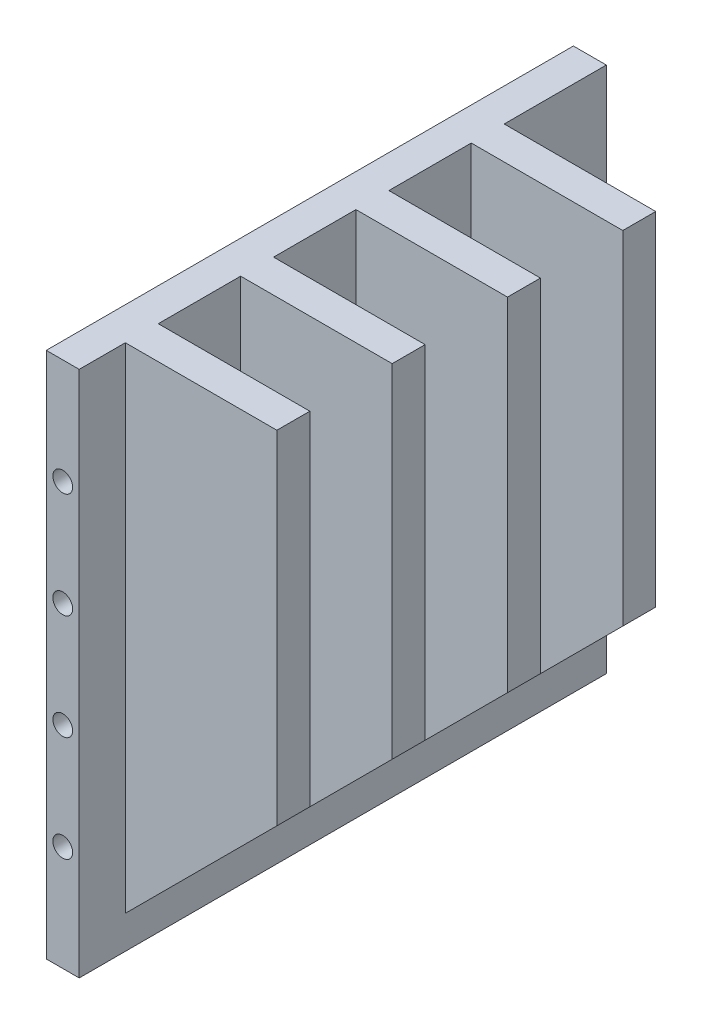
ISO-10303-21;
HEADER;
FILE_DESCRIPTION(('STEP AP214'),'2;1');
FILE_NAME('part.step','',(''),(''),'','','');
FILE_SCHEMA(('AUTOMOTIVE_DESIGN { 1 0 10303 214 1 1 1 1 }'));
ENDSEC;
DATA;
#1=APPLICATION_CONTEXT('core data for automotive mechanical design processes');
#2=APPLICATION_PROTOCOL_DEFINITION('international standard','automotive_design',2000,#1);
#3=PRODUCT_CONTEXT('',#1,'mechanical');
#4=PRODUCT('Part','Part','',(#3));
#5=PRODUCT_RELATED_PRODUCT_CATEGORY('part','',(#4));
#6=PRODUCT_DEFINITION_FORMATION('','',#4);
#7=PRODUCT_DEFINITION_CONTEXT('part definition',#1,'design');
#8=PRODUCT_DEFINITION('design','',#6,#7);
#9=PRODUCT_DEFINITION_SHAPE('','',#8);
#10=(LENGTH_UNIT() NAMED_UNIT(*) SI_UNIT(.MILLI.,.METRE.));
#11=(NAMED_UNIT(*) PLANE_ANGLE_UNIT() SI_UNIT($,.RADIAN.));
#12=(NAMED_UNIT(*) SI_UNIT($,.STERADIAN.) SOLID_ANGLE_UNIT());
#13=UNCERTAINTY_MEASURE_WITH_UNIT(LENGTH_MEASURE(1.E-05),#10,'distance_accuracy_value','');
#14=(GEOMETRIC_REPRESENTATION_CONTEXT(3) GLOBAL_UNCERTAINTY_ASSIGNED_CONTEXT((#13)) GLOBAL_UNIT_ASSIGNED_CONTEXT((#10,
#11,#12)) REPRESENTATION_CONTEXT('',''));
#15=CARTESIAN_POINT('',(0.,0.,0.));
#16=DIRECTION('',(0.,0.,1.));
#17=DIRECTION('',(1.,0.,0.));
#18=AXIS2_PLACEMENT_3D('',#15,#16,#17);
#19=CARTESIAN_POINT('',(6.34999999999999,101.6,-52.07));
#20=DIRECTION('',(-1.,0.,0.));
#21=DIRECTION('',(0.,0.,1.));
#22=AXIS2_PLACEMENT_3D('',#19,#20,#21);
#23=PLANE('',#22);
#24=DIRECTION('',(0.,0.,1.));
#25=VECTOR('',#24,1.);
#26=CARTESIAN_POINT('',(6.35,6.34999999999933,-26.035));
#27=LINE('',#26,#25);
#28=CARTESIAN_POINT('',(6.34999999999999,6.34999999999933,-32.385));
#29=VERTEX_POINT('',#28);
#30=CARTESIAN_POINT('',(6.35,6.34999999999933,-26.035));
#31=VERTEX_POINT('',#30);
#32=EDGE_CURVE('E509',#29,#31,#27,.T.);
#33=ORIENTED_EDGE('',*,*,#32,.T.);
#34=DIRECTION('',(0.,1.,0.));
#35=VECTOR('',#34,1.);
#36=CARTESIAN_POINT('',(6.34999999999999,44.45,-26.035));
#37=LINE('',#36,#35);
#38=CARTESIAN_POINT('',(6.35000000000003,101.6,-26.035));
#39=VERTEX_POINT('',#38);
#40=EDGE_CURVE('E289',#31,#39,#37,.T.);
#41=ORIENTED_EDGE('',*,*,#40,.T.);
#42=DIRECTION('',(0.,0.,-1.));
#43=VECTOR('',#42,1.);
#44=CARTESIAN_POINT('',(6.35000000000001,101.6,19.05));
#45=LINE('',#44,#43);
#46=CARTESIAN_POINT('',(6.35000000000002,101.6,-10.16));
#47=VERTEX_POINT('',#46);
#48=EDGE_CURVE('E228',#47,#39,#45,.T.);
#49=ORIENTED_EDGE('',*,*,#48,.F.);
#50=DIRECTION('',(0.,1.,0.));
#51=VECTOR('',#50,1.);
#52=CARTESIAN_POINT('',(6.34999999999999,44.45,-10.16));
#53=LINE('',#52,#51);
#54=CARTESIAN_POINT('',(6.34999999999999,6.34999999999933,-10.16));
#55=VERTEX_POINT('',#54);
#56=EDGE_CURVE('E312',#55,#47,#53,.T.);
#57=ORIENTED_EDGE('',*,*,#56,.F.);
#58=DIRECTION('',(0.,0.,1.));
#59=VECTOR('',#58,1.);
#60=CARTESIAN_POINT('',(6.35000000000001,6.34999999999933,-3.81000000000001));
#61=LINE('',#60,#59);
#62=CARTESIAN_POINT('',(6.35000000000001,6.34999999999933,-3.81000000000001));
#63=VERTEX_POINT('',#62);
#64=EDGE_CURVE('E539',#55,#63,#61,.T.);
#65=ORIENTED_EDGE('',*,*,#64,.T.);
#66=DIRECTION('',(0.,1.,0.));
#67=VECTOR('',#66,1.);
#68=CARTESIAN_POINT('',(6.34999999999999,44.45,-3.81000000000001));
#69=LINE('',#68,#67);
#70=CARTESIAN_POINT('',(6.34999999999999,101.6,-3.81000000000001));
#71=VERTEX_POINT('',#70);
#72=EDGE_CURVE('E313',#63,#71,#69,.T.);
#73=ORIENTED_EDGE('',*,*,#72,.T.);
#74=CARTESIAN_POINT('',(6.35000000000001,101.6,12.065));
#75=VERTEX_POINT('',#74);
#76=EDGE_CURVE('E225',#75,#71,#45,.T.);
#77=ORIENTED_EDGE('',*,*,#76,.F.);
#78=DIRECTION('',(0.,1.,0.));
#79=VECTOR('',#78,1.);
#80=CARTESIAN_POINT('',(6.34999999999999,44.45,12.065));
#81=LINE('',#80,#79);
#82=CARTESIAN_POINT('',(6.34999999999999,6.34999999999933,12.065));
#83=VERTEX_POINT('',#82);
#84=EDGE_CURVE('E336',#83,#75,#81,.T.);
#85=ORIENTED_EDGE('',*,*,#84,.F.);
#86=DIRECTION('',(0.,0.,1.));
#87=VECTOR('',#86,1.);
#88=CARTESIAN_POINT('',(6.35000000000002,6.34999999999933,18.415));
#89=LINE('',#88,#87);
#90=CARTESIAN_POINT('',(6.35000000000002,6.34999999999933,18.415));
#91=VERTEX_POINT('',#90);
#92=EDGE_CURVE('E449',#83,#91,#89,.T.);
#93=ORIENTED_EDGE('',*,*,#92,.T.);
#94=DIRECTION('',(0.,1.,0.));
#95=VECTOR('',#94,1.);
#96=CARTESIAN_POINT('',(6.34999999999999,44.45,18.415));
#97=LINE('',#96,#95);
#98=CARTESIAN_POINT('',(6.34999999999999,101.6,18.415));
#99=VERTEX_POINT('',#98);
#100=EDGE_CURVE('E337',#91,#99,#97,.T.);
#101=ORIENTED_EDGE('',*,*,#100,.T.);
#102=CARTESIAN_POINT('',(6.35,101.6,34.29));
#103=VERTEX_POINT('',#102);
#104=EDGE_CURVE('E217',#103,#99,#45,.T.);
#105=ORIENTED_EDGE('',*,*,#104,.F.);
#106=DIRECTION('',(0.,1.,0.));
#107=VECTOR('',#106,1.);
#108=CARTESIAN_POINT('',(6.35,44.45,34.29));
#109=LINE('',#108,#107);
#110=CARTESIAN_POINT('',(6.35,6.34999999999933,34.29));
#111=VERTEX_POINT('',#110);
#112=EDGE_CURVE('E359',#111,#103,#109,.T.);
#113=ORIENTED_EDGE('',*,*,#112,.F.);
#114=DIRECTION('',(0.,0.,1.));
#115=VECTOR('',#114,1.);
#116=CARTESIAN_POINT('',(6.35000000000004,6.34999999999933,40.64));
#117=LINE('',#116,#115);
#118=CARTESIAN_POINT('',(6.35000000000004,6.34999999999933,40.64));
#119=VERTEX_POINT('',#118);
#120=EDGE_CURVE('E207',#111,#119,#117,.T.);
#121=ORIENTED_EDGE('',*,*,#120,.T.);
#122=DIRECTION('',(0.,1.,0.));
#123=VECTOR('',#122,1.);
#124=CARTESIAN_POINT('',(6.35,44.45,40.64));
#125=LINE('',#124,#123);
#126=CARTESIAN_POINT('',(6.35,101.6,40.64));
#127=VERTEX_POINT('',#126);
#128=EDGE_CURVE('E189',#119,#127,#125,.T.);
#129=ORIENTED_EDGE('',*,*,#128,.T.);
#130=CARTESIAN_POINT('',(6.34999999999999,101.6,49.53));
#131=VERTEX_POINT('',#130);
#132=EDGE_CURVE('E205',#131,#127,#45,.T.);
#133=ORIENTED_EDGE('',*,*,#132,.F.);
#134=DIRECTION('',(0.,-1.,0.));
#135=VECTOR('',#134,1.);
#136=CARTESIAN_POINT('',(6.34999999999999,101.6,49.53));
#137=LINE('',#136,#135);
#138=CARTESIAN_POINT('',(6.34999999999999,0.,49.53));
#139=VERTEX_POINT('',#138);
#140=EDGE_CURVE('E518',#131,#139,#137,.T.);
#141=ORIENTED_EDGE('',*,*,#140,.T.);
#142=DIRECTION('',(0.,0.,-1.));
#143=VECTOR('',#142,1.);
#144=CARTESIAN_POINT('',(6.34999999999999,0.,-52.07));
#145=LINE('',#144,#143);
#146=CARTESIAN_POINT('',(6.34999999999999,0.,-52.07));
#147=VERTEX_POINT('',#146);
#148=EDGE_CURVE('E513',#139,#147,#145,.T.);
#149=ORIENTED_EDGE('',*,*,#148,.T.);
#150=DIRECTION('',(0.,-1.,0.));
#151=VECTOR('',#150,1.);
#152=CARTESIAN_POINT('',(6.34999999999999,101.6,-52.07));
#153=LINE('',#152,#151);
#154=CARTESIAN_POINT('',(6.34999999999999,101.6,-52.07));
#155=VERTEX_POINT('',#154);
#156=EDGE_CURVE('E511',#155,#147,#153,.T.);
#157=ORIENTED_EDGE('',*,*,#156,.F.);
#158=CARTESIAN_POINT('',(6.34999999999999,101.6,-32.385));
#159=VERTEX_POINT('',#158);
#160=EDGE_CURVE('E219',#159,#155,#45,.T.);
#161=ORIENTED_EDGE('',*,*,#160,.F.);
#162=DIRECTION('',(0.,1.,0.));
#163=VECTOR('',#162,1.);
#164=CARTESIAN_POINT('',(6.34999999999999,44.45,-32.385));
#165=LINE('',#164,#163);
#166=EDGE_CURVE('E285',#29,#159,#165,.T.);
#167=ORIENTED_EDGE('',*,*,#166,.F.);
#168=EDGE_LOOP('',(#33,#41,#49,#57,#65,#73,#77,#85,#93,#101,#105,#113,#121,#129,#133,#141,#149,
#157,#161,#167));
#169=FACE_BOUND('',#168,.T.);
#170=ADVANCED_FACE('F41',(#169),#23,.F.);
#171=CARTESIAN_POINT('',(6.34999999999999,101.6,49.53));
#172=DIRECTION('',(0.,0.,-1.));
#173=DIRECTION('',(-1.,0.,0.));
#174=AXIS2_PLACEMENT_3D('',#171,#172,#173);
#175=PLANE('',#174);
#176=CARTESIAN_POINT('',(3.175,81.28,49.53));
#177=DIRECTION('',(0.,0.,1.));
#178=DIRECTION('',(1.,0.,0.));
#179=AXIS2_PLACEMENT_3D('',#176,#177,#178);
#180=CIRCLE('',#179,1.90500000000002);
#181=CARTESIAN_POINT('',(5.08000000000001,81.28,49.53));
#182=VERTEX_POINT('',#181);
#183=EDGE_CURVE('E256',#182,#182,#180,.T.);
#184=ORIENTED_EDGE('',*,*,#183,.F.);
#185=EDGE_LOOP('',(#184));
#186=FACE_BOUND('',#185,.T.);
#187=CARTESIAN_POINT('',(3.175,40.64,49.53));
#188=DIRECTION('',(0.,0.,1.));
#189=DIRECTION('',(1.,0.,0.));
#190=AXIS2_PLACEMENT_3D('',#187,#188,#189);
#191=CIRCLE('',#190,1.905);
#192=CARTESIAN_POINT('',(5.08,40.64,49.53));
#193=VERTEX_POINT('',#192);
#194=EDGE_CURVE('E257',#193,#193,#191,.T.);
#195=ORIENTED_EDGE('',*,*,#194,.F.);
#196=EDGE_LOOP('',(#195));
#197=FACE_BOUND('',#196,.T.);
#198=CARTESIAN_POINT('',(3.17499999999999,20.32,49.53));
#199=DIRECTION('',(0.,0.,1.));
#200=DIRECTION('',(1.,0.,0.));
#201=AXIS2_PLACEMENT_3D('',#198,#199,#200);
#202=CIRCLE('',#201,1.905);
#203=CARTESIAN_POINT('',(5.07999999999999,20.32,49.53));
#204=VERTEX_POINT('',#203);
#205=EDGE_CURVE('E239',#204,#204,#202,.T.);
#206=ORIENTED_EDGE('',*,*,#205,.F.);
#207=EDGE_LOOP('',(#206));
#208=FACE_BOUND('',#207,.T.);
#209=CARTESIAN_POINT('',(3.175,60.96,49.53));
#210=DIRECTION('',(0.,0.,1.));
#211=DIRECTION('',(1.,0.,0.));
#212=AXIS2_PLACEMENT_3D('',#209,#210,#211);
#213=CIRCLE('',#212,1.905);
#214=CARTESIAN_POINT('',(5.08,60.96,49.53));
#215=VERTEX_POINT('',#214);
#216=EDGE_CURVE('E248',#215,#215,#213,.T.);
#217=ORIENTED_EDGE('',*,*,#216,.F.);
#218=EDGE_LOOP('',(#217));
#219=FACE_BOUND('',#218,.T.);
#220=DIRECTION('',(1.,0.,0.));
#221=VECTOR('',#220,1.);
#222=CARTESIAN_POINT('',(6.34999999999999,0.,49.53));
#223=LINE('',#222,#221);
#224=CARTESIAN_POINT('',(0.,0.,49.53));
#225=VERTEX_POINT('',#224);
#226=EDGE_CURVE('E272',#225,#139,#223,.T.);
#227=ORIENTED_EDGE('',*,*,#226,.T.);
#228=ORIENTED_EDGE('',*,*,#140,.F.);
#229=DIRECTION('',(1.,0.,0.));
#230=VECTOR('',#229,1.);
#231=CARTESIAN_POINT('',(6.34999999999999,101.6,49.53));
#232=LINE('',#231,#230);
#233=CARTESIAN_POINT('',(0.,101.6,49.53));
#234=VERTEX_POINT('',#233);
#235=EDGE_CURVE('E213',#234,#131,#232,.T.);
#236=ORIENTED_EDGE('',*,*,#235,.F.);
#237=DIRECTION('',(0.,-1.,0.));
#238=VECTOR('',#237,1.);
#239=CARTESIAN_POINT('',(0.,101.6,49.53));
#240=LINE('',#239,#238);
#241=EDGE_CURVE('E525',#234,#225,#240,.T.);
#242=ORIENTED_EDGE('',*,*,#241,.T.);
#243=EDGE_LOOP('',(#227,#228,#236,#242));
#244=FACE_BOUND('',#243,.T.);
#245=ADVANCED_FACE('F407',(#186,#197,#208,#219,#244),#175,.F.);
#246=CARTESIAN_POINT('',(0.,101.6,-52.07));
#247=DIRECTION('',(0.,0.,1.));
#248=DIRECTION('',(1.,0.,0.));
#249=AXIS2_PLACEMENT_3D('',#246,#247,#248);
#250=PLANE('',#249);
#251=CARTESIAN_POINT('',(3.175,81.28,-52.07));
#252=DIRECTION('',(0.,0.,1.));
#253=DIRECTION('',(1.,0.,0.));
#254=AXIS2_PLACEMENT_3D('',#251,#252,#253);
#255=CIRCLE('',#254,1.90500000000002);
#256=CARTESIAN_POINT('',(5.08000000000001,81.28,-52.07));
#257=VERTEX_POINT('',#256);
#258=EDGE_CURVE('E198',#257,#257,#255,.T.);
#259=ORIENTED_EDGE('',*,*,#258,.T.);
#260=EDGE_LOOP('',(#259));
#261=FACE_BOUND('',#260,.T.);
#262=CARTESIAN_POINT('',(3.175,40.64,-52.07));
#263=DIRECTION('',(0.,0.,1.));
#264=DIRECTION('',(1.,0.,0.));
#265=AXIS2_PLACEMENT_3D('',#262,#263,#264);
#266=CIRCLE('',#265,1.905);
#267=CARTESIAN_POINT('',(5.08,40.64,-52.07));
#268=VERTEX_POINT('',#267);
#269=EDGE_CURVE('E377',#268,#268,#266,.T.);
#270=ORIENTED_EDGE('',*,*,#269,.T.);
#271=EDGE_LOOP('',(#270));
#272=FACE_BOUND('',#271,.T.);
#273=CARTESIAN_POINT('',(3.17499999999999,20.32,-52.07));
#274=DIRECTION('',(0.,0.,1.));
#275=DIRECTION('',(1.,0.,0.));
#276=AXIS2_PLACEMENT_3D('',#273,#274,#275);
#277=CIRCLE('',#276,1.905);
#278=CARTESIAN_POINT('',(5.07999999999999,20.32,-52.07));
#279=VERTEX_POINT('',#278);
#280=EDGE_CURVE('E372',#279,#279,#277,.T.);
#281=ORIENTED_EDGE('',*,*,#280,.T.);
#282=EDGE_LOOP('',(#281));
#283=FACE_BOUND('',#282,.T.);
#284=CARTESIAN_POINT('',(3.175,60.96,-52.07));
#285=DIRECTION('',(0.,0.,1.));
#286=DIRECTION('',(1.,0.,0.));
#287=AXIS2_PLACEMENT_3D('',#284,#285,#286);
#288=CIRCLE('',#287,1.905);
#289=CARTESIAN_POINT('',(5.08,60.96,-52.07));
#290=VERTEX_POINT('',#289);
#291=EDGE_CURVE('E376',#290,#290,#288,.T.);
#292=ORIENTED_EDGE('',*,*,#291,.T.);
#293=EDGE_LOOP('',(#292));
#294=FACE_BOUND('',#293,.T.);
#295=DIRECTION('',(-1.,0.,0.));
#296=VECTOR('',#295,1.);
#297=CARTESIAN_POINT('',(0.,0.,-52.07));
#298=LINE('',#297,#296);
#299=CARTESIAN_POINT('',(0.,0.,-52.07));
#300=VERTEX_POINT('',#299);
#301=EDGE_CURVE('E563',#147,#300,#298,.T.);
#302=ORIENTED_EDGE('',*,*,#301,.T.);
#303=DIRECTION('',(0.,-1.,0.));
#304=VECTOR('',#303,1.);
#305=CARTESIAN_POINT('',(0.,101.6,-52.07));
#306=LINE('',#305,#304);
#307=CARTESIAN_POINT('',(0.,101.6,-52.07));
#308=VERTEX_POINT('',#307);
#309=EDGE_CURVE('E223',#308,#300,#306,.T.);
#310=ORIENTED_EDGE('',*,*,#309,.F.);
#311=DIRECTION('',(-1.,0.,0.));
#312=VECTOR('',#311,1.);
#313=CARTESIAN_POINT('',(0.,101.6,-52.07));
#314=LINE('',#313,#312);
#315=EDGE_CURVE('E216',#155,#308,#314,.T.);
#316=ORIENTED_EDGE('',*,*,#315,.F.);
#317=ORIENTED_EDGE('',*,*,#156,.T.);
#318=EDGE_LOOP('',(#302,#310,#316,#317));
#319=FACE_BOUND('',#318,.T.);
#320=ADVANCED_FACE('F388',(#261,#272,#283,#294,#319),#250,.F.);
#321=CARTESIAN_POINT('',(0.,101.6,19.05));
#322=DIRECTION('',(1.,0.,0.));
#323=DIRECTION('',(0.,0.,-1.));
#324=AXIS2_PLACEMENT_3D('',#321,#322,#323);
#325=PLANE('',#324);
#326=DIRECTION('',(0.,0.,1.));
#327=VECTOR('',#326,1.);
#328=CARTESIAN_POINT('',(0.,0.,19.05));
#329=LINE('',#328,#327);
#330=EDGE_CURVE('E236',#300,#225,#329,.T.);
#331=ORIENTED_EDGE('',*,*,#330,.T.);
#332=ORIENTED_EDGE('',*,*,#241,.F.);
#333=DIRECTION('',(0.,0.,1.));
#334=VECTOR('',#333,1.);
#335=CARTESIAN_POINT('',(0.,101.6,49.53));
#336=LINE('',#335,#334);
#337=EDGE_CURVE('E234',#308,#234,#336,.T.);
#338=ORIENTED_EDGE('',*,*,#337,.F.);
#339=ORIENTED_EDGE('',*,*,#309,.T.);
#340=EDGE_LOOP('',(#331,#332,#338,#339));
#341=FACE_BOUND('',#340,.T.);
#342=ADVANCED_FACE('F526',(#341),#325,.F.);
#343=CARTESIAN_POINT('',(0.,101.6,0.));
#344=DIRECTION('',(0.,-1.,0.));
#345=DIRECTION('',(0.,0.,-1.));
#346=AXIS2_PLACEMENT_3D('',#343,#344,#345);
#347=PLANE('',#346);
#348=ORIENTED_EDGE('',*,*,#337,.T.);
#349=ORIENTED_EDGE('',*,*,#235,.T.);
#350=ORIENTED_EDGE('',*,*,#132,.T.);
#351=DIRECTION('',(1.,0.,0.));
#352=VECTOR('',#351,1.);
#353=CARTESIAN_POINT('',(6.35,101.6,40.64));
#354=LINE('',#353,#352);
#355=CARTESIAN_POINT('',(35.56,101.6,40.64));
#356=VERTEX_POINT('',#355);
#357=EDGE_CURVE('E185',#127,#356,#354,.T.);
#358=ORIENTED_EDGE('',*,*,#357,.T.);
#359=DIRECTION('',(0.,0.,-1.));
#360=VECTOR('',#359,1.);
#361=CARTESIAN_POINT('',(35.56,101.6,34.29));
#362=LINE('',#361,#360);
#363=CARTESIAN_POINT('',(35.56,101.6,34.29));
#364=VERTEX_POINT('',#363);
#365=EDGE_CURVE('E197',#356,#364,#362,.T.);
#366=ORIENTED_EDGE('',*,*,#365,.T.);
#367=DIRECTION('',(-1.,0.,0.));
#368=VECTOR('',#367,1.);
#369=CARTESIAN_POINT('',(6.35,101.6,34.29));
#370=LINE('',#369,#368);
#371=EDGE_CURVE('E209',#364,#103,#370,.T.);
#372=ORIENTED_EDGE('',*,*,#371,.T.);
#373=ORIENTED_EDGE('',*,*,#104,.T.);
#374=DIRECTION('',(1.,0.,0.));
#375=VECTOR('',#374,1.);
#376=CARTESIAN_POINT('',(6.34999999999999,101.6,18.415));
#377=LINE('',#376,#375);
#378=CARTESIAN_POINT('',(35.56,101.6,18.415));
#379=VERTEX_POINT('',#378);
#380=EDGE_CURVE('E356',#99,#379,#377,.T.);
#381=ORIENTED_EDGE('',*,*,#380,.T.);
#382=DIRECTION('',(0.,0.,-1.));
#383=VECTOR('',#382,1.);
#384=CARTESIAN_POINT('',(35.56,101.6,12.065));
#385=LINE('',#384,#383);
#386=CARTESIAN_POINT('',(35.56,101.6,12.065));
#387=VERTEX_POINT('',#386);
#388=EDGE_CURVE('E352',#379,#387,#385,.T.);
#389=ORIENTED_EDGE('',*,*,#388,.T.);
#390=DIRECTION('',(-1.,0.,0.));
#391=VECTOR('',#390,1.);
#392=CARTESIAN_POINT('',(6.34999999999999,101.6,12.065));
#393=LINE('',#392,#391);
#394=EDGE_CURVE('E341',#387,#75,#393,.T.);
#395=ORIENTED_EDGE('',*,*,#394,.T.);
#396=ORIENTED_EDGE('',*,*,#76,.T.);
#397=DIRECTION('',(1.,0.,0.));
#398=VECTOR('',#397,1.);
#399=CARTESIAN_POINT('',(6.34999999999999,101.6,-3.81000000000001));
#400=LINE('',#399,#398);
#401=CARTESIAN_POINT('',(35.56,101.6,-3.81000000000001));
#402=VERTEX_POINT('',#401);
#403=EDGE_CURVE('E332',#71,#402,#400,.T.);
#404=ORIENTED_EDGE('',*,*,#403,.T.);
#405=DIRECTION('',(0.,0.,-1.));
#406=VECTOR('',#405,1.);
#407=CARTESIAN_POINT('',(35.56,101.6,-10.16));
#408=LINE('',#407,#406);
#409=CARTESIAN_POINT('',(35.56,101.6,-10.16));
#410=VERTEX_POINT('',#409);
#411=EDGE_CURVE('E328',#402,#410,#408,.T.);
#412=ORIENTED_EDGE('',*,*,#411,.T.);
#413=DIRECTION('',(-1.,0.,0.));
#414=VECTOR('',#413,1.);
#415=CARTESIAN_POINT('',(6.34999999999999,101.6,-10.16));
#416=LINE('',#415,#414);
#417=EDGE_CURVE('E318',#410,#47,#416,.T.);
#418=ORIENTED_EDGE('',*,*,#417,.T.);
#419=ORIENTED_EDGE('',*,*,#48,.T.);
#420=DIRECTION('',(1.,0.,0.));
#421=VECTOR('',#420,1.);
#422=CARTESIAN_POINT('',(6.34999999999999,101.6,-26.035));
#423=LINE('',#422,#421);
#424=CARTESIAN_POINT('',(35.56,101.6,-26.035));
#425=VERTEX_POINT('',#424);
#426=EDGE_CURVE('E308',#39,#425,#423,.T.);
#427=ORIENTED_EDGE('',*,*,#426,.T.);
#428=DIRECTION('',(0.,0.,-1.));
#429=VECTOR('',#428,1.);
#430=CARTESIAN_POINT('',(35.56,101.6,-32.385));
#431=LINE('',#430,#429);
#432=CARTESIAN_POINT('',(35.56,101.6,-32.385));
#433=VERTEX_POINT('',#432);
#434=EDGE_CURVE('E304',#425,#433,#431,.T.);
#435=ORIENTED_EDGE('',*,*,#434,.T.);
#436=DIRECTION('',(-1.,0.,0.));
#437=VECTOR('',#436,1.);
#438=CARTESIAN_POINT('',(6.34999999999999,101.6,-32.385));
#439=LINE('',#438,#437);
#440=EDGE_CURVE('E294',#433,#159,#439,.T.);
#441=ORIENTED_EDGE('',*,*,#440,.T.);
#442=ORIENTED_EDGE('',*,*,#160,.T.);
#443=ORIENTED_EDGE('',*,*,#315,.T.);
#444=EDGE_LOOP('',(#348,#349,#350,#358,#366,#372,#373,#381,#389,#395,#396,#404,#412,#418,#419,
#427,#435,#441,#442,#443));
#445=FACE_BOUND('',#444,.T.);
#446=ADVANCED_FACE('F212',(#445),#347,.F.);
#447=CARTESIAN_POINT('',(0.,0.,0.));
#448=DIRECTION('',(0.,-1.,0.));
#449=DIRECTION('',(0.,0.,-1.));
#450=AXIS2_PLACEMENT_3D('',#447,#448,#449);
#451=PLANE('',#450);
#452=ORIENTED_EDGE('',*,*,#226,.F.);
#453=ORIENTED_EDGE('',*,*,#330,.F.);
#454=ORIENTED_EDGE('',*,*,#301,.F.);
#455=ORIENTED_EDGE('',*,*,#148,.F.);
#456=EDGE_LOOP('',(#452,#453,#454,#455));
#457=FACE_BOUND('',#456,.T.);
#458=ADVANCED_FACE('F570',(#457),#451,.T.);
#459=CARTESIAN_POINT('',(3.175,60.96,44.704));
#460=DIRECTION('',(0.,0.,1.));
#461=DIRECTION('',(1.,0.,0.));
#462=AXIS2_PLACEMENT_3D('',#459,#460,#461);
#463=CYLINDRICAL_SURFACE('',#462,1.905);
#464=CARTESIAN_POINT('',(3.175,60.96,44.704));
#465=DIRECTION('',(0.,0.,1.));
#466=DIRECTION('',(1.,0.,0.));
#467=AXIS2_PLACEMENT_3D('',#464,#465,#466);
#468=CIRCLE('',#467,1.905);
#469=CARTESIAN_POINT('',(5.08,60.96,44.704));
#470=VERTEX_POINT('',#469);
#471=EDGE_CURVE('E252',#470,#470,#468,.T.);
#472=ORIENTED_EDGE('',*,*,#471,.F.);
#473=EDGE_LOOP('',(#472));
#474=FACE_BOUND('',#473,.T.);
#475=ORIENTED_EDGE('',*,*,#216,.T.);
#476=EDGE_LOOP('',(#475));
#477=FACE_BOUND('',#476,.T.);
#478=ADVANCED_FACE('F572',(#474,#477),#463,.F.);
#479=CARTESIAN_POINT('',(3.175,60.96,44.704));
#480=DIRECTION('',(0.,0.,1.));
#481=DIRECTION('',(1.,0.,0.));
#482=AXIS2_PLACEMENT_3D('',#479,#480,#481);
#483=PLANE('',#482);
#484=ORIENTED_EDGE('',*,*,#471,.T.);
#485=EDGE_LOOP('',(#484));
#486=FACE_BOUND('',#485,.T.);
#487=ADVANCED_FACE('F578',(#486),#483,.T.);
#488=CARTESIAN_POINT('',(3.17499999999999,20.32,44.704));
#489=DIRECTION('',(0.,0.,1.));
#490=DIRECTION('',(1.,0.,0.));
#491=AXIS2_PLACEMENT_3D('',#488,#489,#490);
#492=CYLINDRICAL_SURFACE('',#491,1.905);
#493=CARTESIAN_POINT('',(3.17499999999999,20.32,44.704));
#494=DIRECTION('',(0.,0.,1.));
#495=DIRECTION('',(1.,0.,0.));
#496=AXIS2_PLACEMENT_3D('',#493,#494,#495);
#497=CIRCLE('',#496,1.905);
#498=CARTESIAN_POINT('',(5.07999999999999,20.32,44.704));
#499=VERTEX_POINT('',#498);
#500=EDGE_CURVE('E243',#499,#499,#497,.T.);
#501=ORIENTED_EDGE('',*,*,#500,.F.);
#502=EDGE_LOOP('',(#501));
#503=FACE_BOUND('',#502,.T.);
#504=ORIENTED_EDGE('',*,*,#205,.T.);
#505=EDGE_LOOP('',(#504));
#506=FACE_BOUND('',#505,.T.);
#507=ADVANCED_FACE('F612',(#503,#506),#492,.F.);
#508=CARTESIAN_POINT('',(3.17499999999999,20.32,44.704));
#509=DIRECTION('',(0.,0.,1.));
#510=DIRECTION('',(1.,0.,0.));
#511=AXIS2_PLACEMENT_3D('',#508,#509,#510);
#512=PLANE('',#511);
#513=ORIENTED_EDGE('',*,*,#500,.T.);
#514=EDGE_LOOP('',(#513));
#515=FACE_BOUND('',#514,.T.);
#516=ADVANCED_FACE('F622',(#515),#512,.T.);
#517=CARTESIAN_POINT('',(3.175,40.64,44.704));
#518=DIRECTION('',(0.,0.,1.));
#519=DIRECTION('',(1.,0.,0.));
#520=AXIS2_PLACEMENT_3D('',#517,#518,#519);
#521=CYLINDRICAL_SURFACE('',#520,1.905);
#522=CARTESIAN_POINT('',(3.175,40.64,44.704));
#523=DIRECTION('',(0.,0.,1.));
#524=DIRECTION('',(1.,0.,0.));
#525=AXIS2_PLACEMENT_3D('',#522,#523,#524);
#526=CIRCLE('',#525,1.905);
#527=CARTESIAN_POINT('',(5.08,40.64,44.704));
#528=VERTEX_POINT('',#527);
#529=EDGE_CURVE('E244',#528,#528,#526,.T.);
#530=ORIENTED_EDGE('',*,*,#529,.F.);
#531=EDGE_LOOP('',(#530));
#532=FACE_BOUND('',#531,.T.);
#533=ORIENTED_EDGE('',*,*,#194,.T.);
#534=EDGE_LOOP('',(#533));
#535=FACE_BOUND('',#534,.T.);
#536=ADVANCED_FACE('F631',(#532,#535),#521,.F.);
#537=CARTESIAN_POINT('',(3.175,40.64,44.704));
#538=DIRECTION('',(0.,0.,1.));
#539=DIRECTION('',(1.,0.,0.));
#540=AXIS2_PLACEMENT_3D('',#537,#538,#539);
#541=PLANE('',#540);
#542=ORIENTED_EDGE('',*,*,#529,.T.);
#543=EDGE_LOOP('',(#542));
#544=FACE_BOUND('',#543,.T.);
#545=ADVANCED_FACE('F641',(#544),#541,.T.);
#546=CARTESIAN_POINT('',(3.175,81.28,44.704));
#547=DIRECTION('',(0.,0.,1.));
#548=DIRECTION('',(1.,0.,0.));
#549=AXIS2_PLACEMENT_3D('',#546,#547,#548);
#550=CYLINDRICAL_SURFACE('',#549,1.90500000000002);
#551=CARTESIAN_POINT('',(3.175,81.28,44.704));
#552=DIRECTION('',(0.,0.,1.));
#553=DIRECTION('',(1.,0.,0.));
#554=AXIS2_PLACEMENT_3D('',#551,#552,#553);
#555=CIRCLE('',#554,1.90500000000002);
#556=CARTESIAN_POINT('',(5.08000000000001,81.28,44.704));
#557=VERTEX_POINT('',#556);
#558=EDGE_CURVE('E268',#557,#557,#555,.T.);
#559=ORIENTED_EDGE('',*,*,#558,.F.);
#560=EDGE_LOOP('',(#559));
#561=FACE_BOUND('',#560,.T.);
#562=ORIENTED_EDGE('',*,*,#183,.T.);
#563=EDGE_LOOP('',(#562));
#564=FACE_BOUND('',#563,.T.);
#565=ADVANCED_FACE('F651',(#561,#564),#550,.F.);
#566=CARTESIAN_POINT('',(3.175,81.28,44.704));
#567=DIRECTION('',(0.,0.,1.));
#568=DIRECTION('',(1.,0.,0.));
#569=AXIS2_PLACEMENT_3D('',#566,#567,#568);
#570=PLANE('',#569);
#571=ORIENTED_EDGE('',*,*,#558,.T.);
#572=EDGE_LOOP('',(#571));
#573=FACE_BOUND('',#572,.T.);
#574=ADVANCED_FACE('F661',(#573),#570,.T.);
#575=CARTESIAN_POINT('',(6.34999999999999,44.45,-32.385));
#576=DIRECTION('',(0.,0.,-1.));
#577=DIRECTION('',(-1.,0.,0.));
#578=AXIS2_PLACEMENT_3D('',#575,#576,#577);
#579=PLANE('',#578);
#580=ORIENTED_EDGE('',*,*,#440,.F.);
#581=DIRECTION('',(0.,1.,0.));
#582=VECTOR('',#581,1.);
#583=CARTESIAN_POINT('',(35.56,44.45,-32.385));
#584=LINE('',#583,#582);
#585=CARTESIAN_POINT('',(35.56,35.5599999999996,-32.385));
#586=VERTEX_POINT('',#585);
#587=EDGE_CURVE('E297',#586,#433,#584,.T.);
#588=ORIENTED_EDGE('',*,*,#587,.F.);
#589=DIRECTION('',(0.707106781186544,0.707106781186551,0.));
#590=VECTOR('',#589,1.);
#591=CARTESIAN_POINT('',(6.35,6.34999999999932,-32.385));
#592=LINE('',#591,#590);
#593=EDGE_CURVE('E507',#586,#29,#592,.F.);
#594=ORIENTED_EDGE('',*,*,#593,.T.);
#595=ORIENTED_EDGE('',*,*,#166,.T.);
#596=EDGE_LOOP('',(#580,#588,#594,#595));
#597=FACE_BOUND('',#596,.T.);
#598=ADVANCED_FACE('F504',(#597),#579,.T.);
#599=CARTESIAN_POINT('',(35.56,44.45,-32.385));
#600=DIRECTION('',(1.,0.,0.));
#601=DIRECTION('',(0.,0.,-1.));
#602=AXIS2_PLACEMENT_3D('',#599,#600,#601);
#603=PLANE('',#602);
#604=ORIENTED_EDGE('',*,*,#434,.F.);
#605=DIRECTION('',(0.,1.,0.));
#606=VECTOR('',#605,1.);
#607=CARTESIAN_POINT('',(35.56,44.45,-26.035));
#608=LINE('',#607,#606);
#609=CARTESIAN_POINT('',(35.56,35.5599999999996,-26.035));
#610=VERTEX_POINT('',#609);
#611=EDGE_CURVE('E293',#610,#425,#608,.T.);
#612=ORIENTED_EDGE('',*,*,#611,.F.);
#613=DIRECTION('',(0.,0.,1.));
#614=VECTOR('',#613,1.);
#615=CARTESIAN_POINT('',(35.56,35.5599999999996,-52.07));
#616=LINE('',#615,#614);
#617=EDGE_CURVE('E546',#610,#586,#616,.F.);
#618=ORIENTED_EDGE('',*,*,#617,.T.);
#619=ORIENTED_EDGE('',*,*,#587,.T.);
#620=EDGE_LOOP('',(#604,#612,#618,#619));
#621=FACE_BOUND('',#620,.T.);
#622=ADVANCED_FACE('F501',(#621),#603,.T.);
#623=CARTESIAN_POINT('',(6.34999999999999,44.45,-26.035));
#624=DIRECTION('',(0.,0.,1.));
#625=DIRECTION('',(1.,0.,0.));
#626=AXIS2_PLACEMENT_3D('',#623,#624,#625);
#627=PLANE('',#626);
#628=ORIENTED_EDGE('',*,*,#426,.F.);
#629=ORIENTED_EDGE('',*,*,#40,.F.);
#630=DIRECTION('',(-0.707106781186544,-0.707106781186551,0.));
#631=VECTOR('',#630,1.);
#632=CARTESIAN_POINT('',(6.35,6.34999999999932,-26.035));
#633=LINE('',#632,#631);
#634=EDGE_CURVE('E497',#31,#610,#633,.F.);
#635=ORIENTED_EDGE('',*,*,#634,.T.);
#636=ORIENTED_EDGE('',*,*,#611,.T.);
#637=EDGE_LOOP('',(#628,#629,#635,#636));
#638=FACE_BOUND('',#637,.T.);
#639=ADVANCED_FACE('F493',(#638),#627,.T.);
#640=CARTESIAN_POINT('',(6.34999999999999,44.45,-10.16));
#641=DIRECTION('',(0.,0.,-1.));
#642=DIRECTION('',(-1.,0.,0.));
#643=AXIS2_PLACEMENT_3D('',#640,#641,#642);
#644=PLANE('',#643);
#645=ORIENTED_EDGE('',*,*,#417,.F.);
#646=DIRECTION('',(0.,1.,0.));
#647=VECTOR('',#646,1.);
#648=CARTESIAN_POINT('',(35.56,44.45,-10.16));
#649=LINE('',#648,#647);
#650=CARTESIAN_POINT('',(35.56,35.5599999999996,-10.16));
#651=VERTEX_POINT('',#650);
#652=EDGE_CURVE('E87',#651,#410,#649,.T.);
#653=ORIENTED_EDGE('',*,*,#652,.F.);
#654=DIRECTION('',(0.707106781186544,0.707106781186551,0.));
#655=VECTOR('',#654,1.);
#656=CARTESIAN_POINT('',(6.35,6.34999999999932,-10.16));
#657=LINE('',#656,#655);
#658=EDGE_CURVE('E489',#651,#55,#657,.F.);
#659=ORIENTED_EDGE('',*,*,#658,.T.);
#660=ORIENTED_EDGE('',*,*,#56,.T.);
#661=EDGE_LOOP('',(#645,#653,#659,#660));
#662=FACE_BOUND('',#661,.T.);
#663=ADVANCED_FACE('F486',(#662),#644,.T.);
#664=CARTESIAN_POINT('',(35.56,44.45,-10.16));
#665=DIRECTION('',(1.,0.,0.));
#666=DIRECTION('',(0.,0.,-1.));
#667=AXIS2_PLACEMENT_3D('',#664,#665,#666);
#668=PLANE('',#667);
#669=ORIENTED_EDGE('',*,*,#411,.F.);
#670=DIRECTION('',(0.,1.,0.));
#671=VECTOR('',#670,1.);
#672=CARTESIAN_POINT('',(35.56,44.45,-3.81000000000001));
#673=LINE('',#672,#671);
#674=CARTESIAN_POINT('',(35.56,35.5599999999996,-3.81000000000001));
#675=VERTEX_POINT('',#674);
#676=EDGE_CURVE('E317',#675,#402,#673,.T.);
#677=ORIENTED_EDGE('',*,*,#676,.F.);
#678=DIRECTION('',(0.,0.,1.));
#679=VECTOR('',#678,1.);
#680=CARTESIAN_POINT('',(35.56,35.5599999999996,-52.07));
#681=LINE('',#680,#679);
#682=EDGE_CURVE('E553',#675,#651,#681,.F.);
#683=ORIENTED_EDGE('',*,*,#682,.T.);
#684=ORIENTED_EDGE('',*,*,#652,.T.);
#685=EDGE_LOOP('',(#669,#677,#683,#684));
#686=FACE_BOUND('',#685,.T.);
#687=ADVANCED_FACE('F485',(#686),#668,.T.);
#688=CARTESIAN_POINT('',(6.34999999999999,44.45,-3.81000000000001));
#689=DIRECTION('',(0.,0.,1.));
#690=DIRECTION('',(1.,0.,0.));
#691=AXIS2_PLACEMENT_3D('',#688,#689,#690);
#692=PLANE('',#691);
#693=ORIENTED_EDGE('',*,*,#403,.F.);
#694=ORIENTED_EDGE('',*,*,#72,.F.);
#695=DIRECTION('',(-0.707106781186544,-0.707106781186551,0.));
#696=VECTOR('',#695,1.);
#697=CARTESIAN_POINT('',(6.35,6.34999999999932,-3.81000000000001));
#698=LINE('',#697,#696);
#699=EDGE_CURVE('E482',#63,#675,#698,.F.);
#700=ORIENTED_EDGE('',*,*,#699,.T.);
#701=ORIENTED_EDGE('',*,*,#676,.T.);
#702=EDGE_LOOP('',(#693,#694,#700,#701));
#703=FACE_BOUND('',#702,.T.);
#704=ADVANCED_FACE('F478',(#703),#692,.T.);
#705=CARTESIAN_POINT('',(6.34999999999999,44.45,12.065));
#706=DIRECTION('',(0.,0.,-1.));
#707=DIRECTION('',(-1.,0.,0.));
#708=AXIS2_PLACEMENT_3D('',#705,#706,#707);
#709=PLANE('',#708);
#710=ORIENTED_EDGE('',*,*,#394,.F.);
#711=DIRECTION('',(0.,1.,0.));
#712=VECTOR('',#711,1.);
#713=CARTESIAN_POINT('',(35.56,44.45,12.065));
#714=LINE('',#713,#712);
#715=CARTESIAN_POINT('',(35.56,35.5599999999996,12.065));
#716=VERTEX_POINT('',#715);
#717=EDGE_CURVE('E344',#716,#387,#714,.T.);
#718=ORIENTED_EDGE('',*,*,#717,.F.);
#719=DIRECTION('',(0.707106781186544,0.707106781186551,0.));
#720=VECTOR('',#719,1.);
#721=CARTESIAN_POINT('',(6.35000000000001,6.34999999999931,12.065));
#722=LINE('',#721,#720);
#723=EDGE_CURVE('E445',#716,#83,#722,.F.);
#724=ORIENTED_EDGE('',*,*,#723,.T.);
#725=ORIENTED_EDGE('',*,*,#84,.T.);
#726=EDGE_LOOP('',(#710,#718,#724,#725));
#727=FACE_BOUND('',#726,.T.);
#728=ADVANCED_FACE('F472',(#727),#709,.T.);
#729=CARTESIAN_POINT('',(35.56,44.45,12.065));
#730=DIRECTION('',(1.,0.,0.));
#731=DIRECTION('',(0.,0.,-1.));
#732=AXIS2_PLACEMENT_3D('',#729,#730,#731);
#733=PLANE('',#732);
#734=ORIENTED_EDGE('',*,*,#388,.F.);
#735=DIRECTION('',(0.,1.,0.));
#736=VECTOR('',#735,1.);
#737=CARTESIAN_POINT('',(35.56,44.45,18.415));
#738=LINE('',#737,#736);
#739=CARTESIAN_POINT('',(35.56,35.5599999999996,18.415));
#740=VERTEX_POINT('',#739);
#741=EDGE_CURVE('E79',#740,#379,#738,.T.);
#742=ORIENTED_EDGE('',*,*,#741,.F.);
#743=DIRECTION('',(0.,0.,1.));
#744=VECTOR('',#743,1.);
#745=CARTESIAN_POINT('',(35.56,35.5599999999996,-52.07));
#746=LINE('',#745,#744);
#747=EDGE_CURVE('E447',#740,#716,#746,.F.);
#748=ORIENTED_EDGE('',*,*,#747,.T.);
#749=ORIENTED_EDGE('',*,*,#717,.T.);
#750=EDGE_LOOP('',(#734,#742,#748,#749));
#751=FACE_BOUND('',#750,.T.);
#752=ADVANCED_FACE('F470',(#751),#733,.T.);
#753=CARTESIAN_POINT('',(6.34999999999999,44.45,18.415));
#754=DIRECTION('',(0.,0.,1.));
#755=DIRECTION('',(1.,0.,0.));
#756=AXIS2_PLACEMENT_3D('',#753,#754,#755);
#757=PLANE('',#756);
#758=ORIENTED_EDGE('',*,*,#380,.F.);
#759=ORIENTED_EDGE('',*,*,#100,.F.);
#760=DIRECTION('',(-0.707106781186544,-0.707106781186551,0.));
#761=VECTOR('',#760,1.);
#762=CARTESIAN_POINT('',(6.35000000000001,6.34999999999931,18.415));
#763=LINE('',#762,#761);
#764=EDGE_CURVE('E457',#91,#740,#763,.F.);
#765=ORIENTED_EDGE('',*,*,#764,.T.);
#766=ORIENTED_EDGE('',*,*,#741,.T.);
#767=EDGE_LOOP('',(#758,#759,#765,#766));
#768=FACE_BOUND('',#767,.T.);
#769=ADVANCED_FACE('F469',(#768),#757,.T.);
#770=CARTESIAN_POINT('',(6.35,44.45,34.29));
#771=DIRECTION('',(0.,0.,-1.));
#772=DIRECTION('',(-1.,0.,0.));
#773=AXIS2_PLACEMENT_3D('',#770,#771,#772);
#774=PLANE('',#773);
#775=ORIENTED_EDGE('',*,*,#371,.F.);
#776=DIRECTION('',(0.,1.,0.));
#777=VECTOR('',#776,1.);
#778=CARTESIAN_POINT('',(35.56,44.45,34.29));
#779=LINE('',#778,#777);
#780=CARTESIAN_POINT('',(35.56,35.5599999999996,34.29));
#781=VERTEX_POINT('',#780);
#782=EDGE_CURVE('E58',#781,#364,#779,.T.);
#783=ORIENTED_EDGE('',*,*,#782,.F.);
#784=DIRECTION('',(0.707106781186544,0.707106781186551,0.));
#785=VECTOR('',#784,1.);
#786=CARTESIAN_POINT('',(6.35000000000001,6.34999999999931,34.29));
#787=LINE('',#786,#785);
#788=EDGE_CURVE('E11',#781,#111,#787,.F.);
#789=ORIENTED_EDGE('',*,*,#788,.T.);
#790=ORIENTED_EDGE('',*,*,#112,.T.);
#791=EDGE_LOOP('',(#775,#783,#789,#790));
#792=FACE_BOUND('',#791,.T.);
#793=ADVANCED_FACE('F465',(#792),#774,.T.);
#794=CARTESIAN_POINT('',(35.56,44.45,34.29));
#795=DIRECTION('',(1.,0.,0.));
#796=DIRECTION('',(0.,0.,-1.));
#797=AXIS2_PLACEMENT_3D('',#794,#795,#796);
#798=PLANE('',#797);
#799=ORIENTED_EDGE('',*,*,#365,.F.);
#800=DIRECTION('',(0.,1.,0.));
#801=VECTOR('',#800,1.);
#802=CARTESIAN_POINT('',(35.56,44.45,40.64));
#803=LINE('',#802,#801);
#804=CARTESIAN_POINT('',(35.56,35.5599999999996,40.64));
#805=VERTEX_POINT('',#804);
#806=EDGE_CURVE('E191',#805,#356,#803,.T.);
#807=ORIENTED_EDGE('',*,*,#806,.F.);
#808=DIRECTION('',(0.,0.,1.));
#809=VECTOR('',#808,1.);
#810=CARTESIAN_POINT('',(35.5600000000001,35.5599999999997,-52.0699999999999));
#811=LINE('',#810,#809);
#812=EDGE_CURVE('E52',#805,#781,#811,.F.);
#813=ORIENTED_EDGE('',*,*,#812,.T.);
#814=ORIENTED_EDGE('',*,*,#782,.T.);
#815=EDGE_LOOP('',(#799,#807,#813,#814));
#816=FACE_BOUND('',#815,.T.);
#817=ADVANCED_FACE('F464',(#816),#798,.T.);
#818=CARTESIAN_POINT('',(6.35,44.45,40.64));
#819=DIRECTION('',(0.,0.,1.));
#820=DIRECTION('',(1.,0.,0.));
#821=AXIS2_PLACEMENT_3D('',#818,#819,#820);
#822=PLANE('',#821);
#823=ORIENTED_EDGE('',*,*,#357,.F.);
#824=ORIENTED_EDGE('',*,*,#128,.F.);
#825=DIRECTION('',(-0.707106781186544,-0.707106781186551,0.));
#826=VECTOR('',#825,1.);
#827=CARTESIAN_POINT('',(6.35000000000001,6.34999999999931,40.64));
#828=LINE('',#827,#826);
#829=EDGE_CURVE('E452',#119,#805,#828,.F.);
#830=ORIENTED_EDGE('',*,*,#829,.T.);
#831=ORIENTED_EDGE('',*,*,#806,.T.);
#832=EDGE_LOOP('',(#823,#824,#830,#831));
#833=FACE_BOUND('',#832,.T.);
#834=ADVANCED_FACE('F187',(#833),#822,.T.);
#835=CARTESIAN_POINT('',(6.34999999999999,6.34999999999933,-52.07));
#836=DIRECTION('',(0.707106781186551,-0.707106781186544,0.));
#837=DIRECTION('',(0.,0.,-1.));
#838=AXIS2_PLACEMENT_3D('',#835,#836,#837);
#839=PLANE('',#838);
#840=ORIENTED_EDGE('',*,*,#593,.F.);
#841=ORIENTED_EDGE('',*,*,#617,.F.);
#842=ORIENTED_EDGE('',*,*,#634,.F.);
#843=ORIENTED_EDGE('',*,*,#32,.F.);
#844=EDGE_LOOP('',(#840,#841,#842,#843));
#845=FACE_BOUND('',#844,.T.);
#846=ADVANCED_FACE('F418',(#845),#839,.T.);
#847=CARTESIAN_POINT('',(6.34999999999999,6.34999999999933,-52.07));
#848=DIRECTION('',(0.707106781186551,-0.707106781186544,0.));
#849=DIRECTION('',(0.,0.,-1.));
#850=AXIS2_PLACEMENT_3D('',#847,#848,#849);
#851=PLANE('',#850);
#852=ORIENTED_EDGE('',*,*,#658,.F.);
#853=ORIENTED_EDGE('',*,*,#682,.F.);
#854=ORIENTED_EDGE('',*,*,#699,.F.);
#855=ORIENTED_EDGE('',*,*,#64,.F.);
#856=EDGE_LOOP('',(#852,#853,#854,#855));
#857=FACE_BOUND('',#856,.T.);
#858=ADVANCED_FACE('F424',(#857),#851,.T.);
#859=CARTESIAN_POINT('',(6.34999999999999,6.34999999999933,-52.07));
#860=DIRECTION('',(0.707106781186551,-0.707106781186544,0.));
#861=DIRECTION('',(0.,0.,-1.));
#862=AXIS2_PLACEMENT_3D('',#859,#860,#861);
#863=PLANE('',#862);
#864=ORIENTED_EDGE('',*,*,#723,.F.);
#865=ORIENTED_EDGE('',*,*,#747,.F.);
#866=ORIENTED_EDGE('',*,*,#764,.F.);
#867=ORIENTED_EDGE('',*,*,#92,.F.);
#868=EDGE_LOOP('',(#864,#865,#866,#867));
#869=FACE_BOUND('',#868,.T.);
#870=ADVANCED_FACE('F430',(#869),#863,.T.);
#871=CARTESIAN_POINT('',(6.34999999999999,6.34999999999933,-52.07));
#872=DIRECTION('',(0.707106781186551,-0.707106781186544,0.));
#873=DIRECTION('',(0.,0.,-1.));
#874=AXIS2_PLACEMENT_3D('',#871,#872,#873);
#875=PLANE('',#874);
#876=ORIENTED_EDGE('',*,*,#788,.F.);
#877=ORIENTED_EDGE('',*,*,#812,.F.);
#878=ORIENTED_EDGE('',*,*,#829,.F.);
#879=ORIENTED_EDGE('',*,*,#120,.F.);
#880=EDGE_LOOP('',(#876,#877,#878,#879));
#881=FACE_BOUND('',#880,.T.);
#882=ADVANCED_FACE('F44',(#881),#875,.T.);
#883=CARTESIAN_POINT('',(3.175,60.96,-44.704));
#884=DIRECTION('',(0.,0.,-1.));
#885=DIRECTION('',(-1.,0.,0.));
#886=AXIS2_PLACEMENT_3D('',#883,#884,#885);
#887=CYLINDRICAL_SURFACE('',#886,1.905);
#888=CARTESIAN_POINT('',(3.175,60.96,-44.704));
#889=DIRECTION('',(0.,0.,1.));
#890=DIRECTION('',(1.,0.,0.));
#891=AXIS2_PLACEMENT_3D('',#888,#889,#890);
#892=CIRCLE('',#891,1.905);
#893=CARTESIAN_POINT('',(5.08,60.96,-44.704));
#894=VERTEX_POINT('',#893);
#895=EDGE_CURVE('E277',#894,#894,#892,.T.);
#896=ORIENTED_EDGE('',*,*,#895,.T.);
#897=EDGE_LOOP('',(#896));
#898=FACE_BOUND('',#897,.T.);
#899=ORIENTED_EDGE('',*,*,#291,.F.);
#900=EDGE_LOOP('',(#899));
#901=FACE_BOUND('',#900,.T.);
#902=ADVANCED_FACE('F439',(#898,#901),#887,.F.);
#903=CARTESIAN_POINT('',(3.175,60.96,-44.704));
#904=DIRECTION('',(0.,0.,-1.));
#905=DIRECTION('',(1.,0.,0.));
#906=AXIS2_PLACEMENT_3D('',#903,#904,#905);
#907=PLANE('',#906);
#908=ORIENTED_EDGE('',*,*,#895,.F.);
#909=EDGE_LOOP('',(#908));
#910=FACE_BOUND('',#909,.T.);
#911=ADVANCED_FACE('F706',(#910),#907,.T.);
#912=CARTESIAN_POINT('',(3.17499999999999,20.32,-44.704));
#913=DIRECTION('',(0.,0.,-1.));
#914=DIRECTION('',(-1.,0.,0.));
#915=AXIS2_PLACEMENT_3D('',#912,#913,#914);
#916=CYLINDRICAL_SURFACE('',#915,1.905);
#917=CARTESIAN_POINT('',(3.17499999999999,20.32,-44.704));
#918=DIRECTION('',(0.,0.,1.));
#919=DIRECTION('',(1.,0.,0.));
#920=AXIS2_PLACEMENT_3D('',#917,#918,#919);
#921=CIRCLE('',#920,1.905);
#922=CARTESIAN_POINT('',(5.07999999999999,20.32,-44.704));
#923=VERTEX_POINT('',#922);
#924=EDGE_CURVE('E273',#923,#923,#921,.T.);
#925=ORIENTED_EDGE('',*,*,#924,.T.);
#926=EDGE_LOOP('',(#925));
#927=FACE_BOUND('',#926,.T.);
#928=ORIENTED_EDGE('',*,*,#280,.F.);
#929=EDGE_LOOP('',(#928));
#930=FACE_BOUND('',#929,.T.);
#931=ADVANCED_FACE('F698',(#927,#930),#916,.F.);
#932=CARTESIAN_POINT('',(3.17499999999999,20.32,-44.704));
#933=DIRECTION('',(0.,0.,-1.));
#934=DIRECTION('',(1.,0.,0.));
#935=AXIS2_PLACEMENT_3D('',#932,#933,#934);
#936=PLANE('',#935);
#937=ORIENTED_EDGE('',*,*,#924,.F.);
#938=EDGE_LOOP('',(#937));
#939=FACE_BOUND('',#938,.T.);
#940=ADVANCED_FACE('F693',(#939),#936,.T.);
#941=CARTESIAN_POINT('',(3.175,40.64,-44.704));
#942=DIRECTION('',(0.,0.,-1.));
#943=DIRECTION('',(-1.,0.,0.));
#944=AXIS2_PLACEMENT_3D('',#941,#942,#943);
#945=CYLINDRICAL_SURFACE('',#944,1.905);
#946=CARTESIAN_POINT('',(3.175,40.64,-44.704));
#947=DIRECTION('',(0.,0.,1.));
#948=DIRECTION('',(1.,0.,0.));
#949=AXIS2_PLACEMENT_3D('',#946,#947,#948);
#950=CIRCLE('',#949,1.905);
#951=CARTESIAN_POINT('',(5.08,40.64,-44.704));
#952=VERTEX_POINT('',#951);
#953=EDGE_CURVE('E278',#952,#952,#950,.T.);
#954=ORIENTED_EDGE('',*,*,#953,.T.);
#955=EDGE_LOOP('',(#954));
#956=FACE_BOUND('',#955,.T.);
#957=ORIENTED_EDGE('',*,*,#269,.F.);
#958=EDGE_LOOP('',(#957));
#959=FACE_BOUND('',#958,.T.);
#960=ADVANCED_FACE('F403',(#956,#959),#945,.F.);
#961=CARTESIAN_POINT('',(3.175,40.64,-44.704));
#962=DIRECTION('',(0.,0.,-1.));
#963=DIRECTION('',(1.,0.,0.));
#964=AXIS2_PLACEMENT_3D('',#961,#962,#963);
#965=PLANE('',#964);
#966=ORIENTED_EDGE('',*,*,#953,.F.);
#967=EDGE_LOOP('',(#966));
#968=FACE_BOUND('',#967,.T.);
#969=ADVANCED_FACE('F394',(#968),#965,.T.);
#970=CARTESIAN_POINT('',(3.175,81.28,-44.704));
#971=DIRECTION('',(0.,0.,-1.));
#972=DIRECTION('',(-1.,0.,0.));
#973=AXIS2_PLACEMENT_3D('',#970,#971,#972);
#974=CYLINDRICAL_SURFACE('',#973,1.90500000000002);
#975=CARTESIAN_POINT('',(3.175,81.28,-44.704));
#976=DIRECTION('',(0.,0.,1.));
#977=DIRECTION('',(1.,0.,0.));
#978=AXIS2_PLACEMENT_3D('',#975,#976,#977);
#979=CIRCLE('',#978,1.90500000000002);
#980=CARTESIAN_POINT('',(5.08000000000001,81.28,-44.704));
#981=VERTEX_POINT('',#980);
#982=EDGE_CURVE('E261',#981,#981,#979,.T.);
#983=ORIENTED_EDGE('',*,*,#982,.T.);
#984=EDGE_LOOP('',(#983));
#985=FACE_BOUND('',#984,.T.);
#986=ORIENTED_EDGE('',*,*,#258,.F.);
#987=EDGE_LOOP('',(#986));
#988=FACE_BOUND('',#987,.T.);
#989=ADVANCED_FACE('F391',(#985,#988),#974,.F.);
#990=CARTESIAN_POINT('',(3.175,81.28,-44.704));
#991=DIRECTION('',(0.,0.,-1.));
#992=DIRECTION('',(1.,0.,0.));
#993=AXIS2_PLACEMENT_3D('',#990,#991,#992);
#994=PLANE('',#993);
#995=ORIENTED_EDGE('',*,*,#982,.F.);
#996=EDGE_LOOP('',(#995));
#997=FACE_BOUND('',#996,.T.);
#998=ADVANCED_FACE('F393',(#997),#994,.T.);
#999=CLOSED_SHELL('',(#170,#245,#320,#342,#446,#458,#478,#487,#507,#516,#536,#545,#565,#574,
#598,#622,#639,#663,#687,#704,#728,#752,#769,#793,#817,#834,#846,#858,#870,#882,#902,#911,#931,
#940,#960,#969,#989,#998));
#1000=MANIFOLD_SOLID_BREP('B2',#999);
#1001=ADVANCED_BREP_SHAPE_REPRESENTATION('',(#18,#1000),#14);
#1002=SHAPE_DEFINITION_REPRESENTATION(#9,#1001);
ENDSEC;
END-ISO-10303-21;
